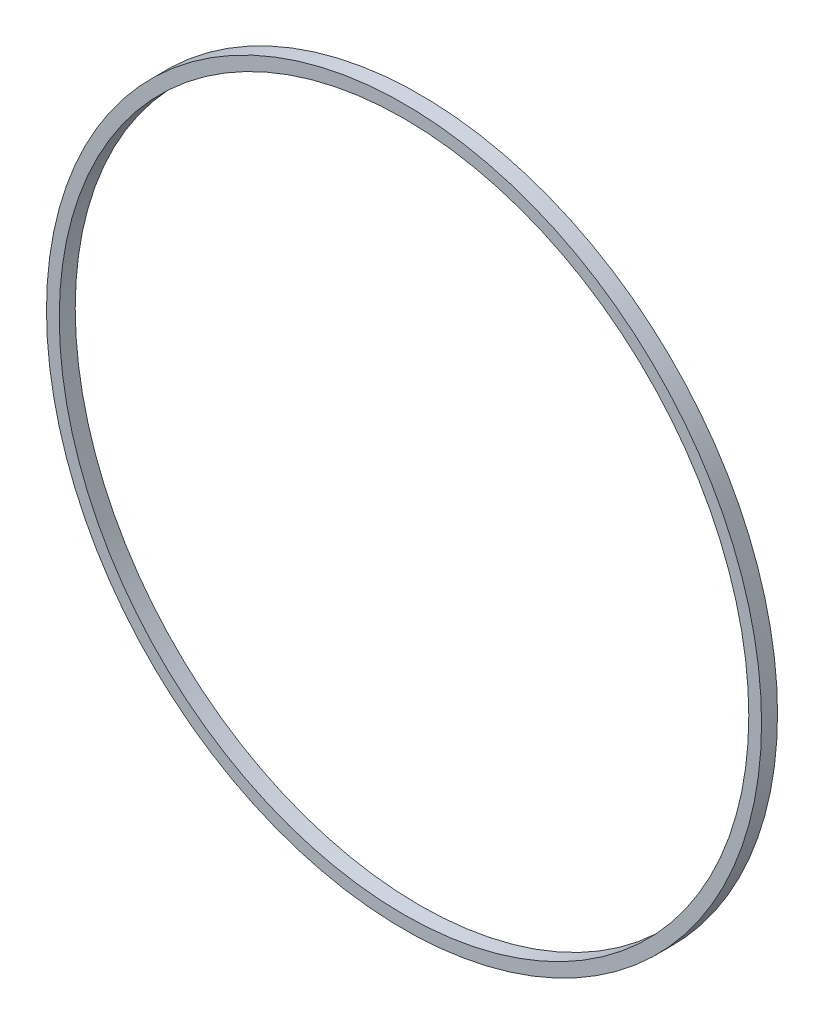
ISO-10303-21;
HEADER;
FILE_DESCRIPTION(('STEP AP214'),'2;1');
FILE_NAME('part.step','',(''),(''),'','','');
FILE_SCHEMA(('AUTOMOTIVE_DESIGN { 1 0 10303 214 1 1 1 1 }'));
ENDSEC;
DATA;
#1=APPLICATION_CONTEXT('core data for automotive mechanical design processes');
#2=APPLICATION_PROTOCOL_DEFINITION('international standard','automotive_design',2000,#1);
#3=PRODUCT_CONTEXT('',#1,'mechanical');
#4=PRODUCT('Part','Part','',(#3));
#5=PRODUCT_RELATED_PRODUCT_CATEGORY('part','',(#4));
#6=PRODUCT_DEFINITION_FORMATION('','',#4);
#7=PRODUCT_DEFINITION_CONTEXT('part definition',#1,'design');
#8=PRODUCT_DEFINITION('design','',#6,#7);
#9=PRODUCT_DEFINITION_SHAPE('','',#8);
#10=(LENGTH_UNIT() NAMED_UNIT(*) SI_UNIT(.MILLI.,.METRE.));
#11=(NAMED_UNIT(*) PLANE_ANGLE_UNIT() SI_UNIT($,.RADIAN.));
#12=(NAMED_UNIT(*) SI_UNIT($,.STERADIAN.) SOLID_ANGLE_UNIT());
#13=UNCERTAINTY_MEASURE_WITH_UNIT(LENGTH_MEASURE(1.E-05),#10,'distance_accuracy_value','');
#14=(GEOMETRIC_REPRESENTATION_CONTEXT(3) GLOBAL_UNCERTAINTY_ASSIGNED_CONTEXT((#13)) GLOBAL_UNIT_ASSIGNED_CONTEXT((#10,
#11,#12)) REPRESENTATION_CONTEXT('',''));
#15=CARTESIAN_POINT('',(0.,0.,0.));
#16=DIRECTION('',(0.,0.,1.));
#17=DIRECTION('',(1.,0.,0.));
#18=AXIS2_PLACEMENT_3D('',#15,#16,#17);
#19=CARTESIAN_POINT('',(0.,0.,2.5));
#20=DIRECTION('',(0.,0.,-1.));
#21=DIRECTION('',(-1.,0.,0.));
#22=AXIS2_PLACEMENT_3D('',#19,#20,#21);
#23=CYLINDRICAL_SURFACE('',#22,56.);
#24=CARTESIAN_POINT('',(0.,0.,2.5));
#25=DIRECTION('',(0.,0.,1.));
#26=DIRECTION('',(1.,0.,0.));
#27=AXIS2_PLACEMENT_3D('',#24,#25,#26);
#28=CIRCLE('',#27,56.);
#29=CARTESIAN_POINT('',(56.,0.,2.5));
#30=VERTEX_POINT('',#29);
#31=EDGE_CURVE('E10',#30,#30,#28,.T.);
#32=ORIENTED_EDGE('',*,*,#31,.F.);
#33=EDGE_LOOP('',(#32));
#34=FACE_BOUND('',#33,.T.);
#35=CARTESIAN_POINT('',(0.,0.,0.));
#36=DIRECTION('',(0.,0.,1.));
#37=DIRECTION('',(1.,0.,0.));
#38=AXIS2_PLACEMENT_3D('',#35,#36,#37);
#39=CIRCLE('',#38,56.);
#40=CARTESIAN_POINT('',(56.,0.,0.));
#41=VERTEX_POINT('',#40);
#42=EDGE_CURVE('E37',#41,#41,#39,.T.);
#43=ORIENTED_EDGE('',*,*,#42,.T.);
#44=EDGE_LOOP('',(#43));
#45=FACE_BOUND('',#44,.T.);
#46=ADVANCED_FACE('F40',(#34,#45),#23,.T.);
#47=CARTESIAN_POINT('',(0.,0.,2.5));
#48=DIRECTION('',(0.,0.,1.));
#49=DIRECTION('',(1.,0.,0.));
#50=AXIS2_PLACEMENT_3D('',#47,#48,#49);
#51=PLANE('',#50);
#52=CARTESIAN_POINT('',(0.,0.,2.5));
#53=DIRECTION('',(0.,0.,1.));
#54=DIRECTION('',(1.,0.,0.));
#55=AXIS2_PLACEMENT_3D('',#52,#53,#54);
#56=CIRCLE('',#55,54.);
#57=CARTESIAN_POINT('',(54.,0.,2.5));
#58=VERTEX_POINT('',#57);
#59=EDGE_CURVE('E47',#58,#58,#56,.T.);
#60=ORIENTED_EDGE('',*,*,#59,.F.);
#61=EDGE_LOOP('',(#60));
#62=FACE_BOUND('',#61,.T.);
#63=ORIENTED_EDGE('',*,*,#31,.T.);
#64=EDGE_LOOP('',(#63));
#65=FACE_BOUND('',#64,.T.);
#66=ADVANCED_FACE('F61',(#62,#65),#51,.T.);
#67=CARTESIAN_POINT('',(0.,0.,0.));
#68=DIRECTION('',(0.,0.,1.));
#69=DIRECTION('',(1.,0.,0.));
#70=AXIS2_PLACEMENT_3D('',#67,#68,#69);
#71=PLANE('',#70);
#72=CARTESIAN_POINT('',(0.,0.,0.));
#73=DIRECTION('',(0.,0.,1.));
#74=DIRECTION('',(1.,0.,0.));
#75=AXIS2_PLACEMENT_3D('',#72,#73,#74);
#76=CIRCLE('',#75,54.);
#77=CARTESIAN_POINT('',(54.,0.,0.));
#78=VERTEX_POINT('',#77);
#79=EDGE_CURVE('E50',#78,#78,#76,.T.);
#80=ORIENTED_EDGE('',*,*,#79,.T.);
#81=EDGE_LOOP('',(#80));
#82=FACE_BOUND('',#81,.T.);
#83=ORIENTED_EDGE('',*,*,#42,.F.);
#84=EDGE_LOOP('',(#83));
#85=FACE_BOUND('',#84,.T.);
#86=ADVANCED_FACE('F54',(#82,#85),#71,.F.);
#87=CARTESIAN_POINT('',(0.,0.,0.));
#88=DIRECTION('',(0.,0.,1.));
#89=DIRECTION('',(1.,0.,0.));
#90=AXIS2_PLACEMENT_3D('',#87,#88,#89);
#91=CYLINDRICAL_SURFACE('',#90,54.);
#92=ORIENTED_EDGE('',*,*,#79,.F.);
#93=EDGE_LOOP('',(#92));
#94=FACE_BOUND('',#93,.T.);
#95=ORIENTED_EDGE('',*,*,#59,.T.);
#96=EDGE_LOOP('',(#95));
#97=FACE_BOUND('',#96,.T.);
#98=ADVANCED_FACE('F59',(#94,#97),#91,.F.);
#99=CLOSED_SHELL('',(#46,#66,#86,#98));
#100=MANIFOLD_SOLID_BREP('B2',#99);
#101=ADVANCED_BREP_SHAPE_REPRESENTATION('',(#18,#100),#14);
#102=SHAPE_DEFINITION_REPRESENTATION(#9,#101);
ENDSEC;
END-ISO-10303-21;
